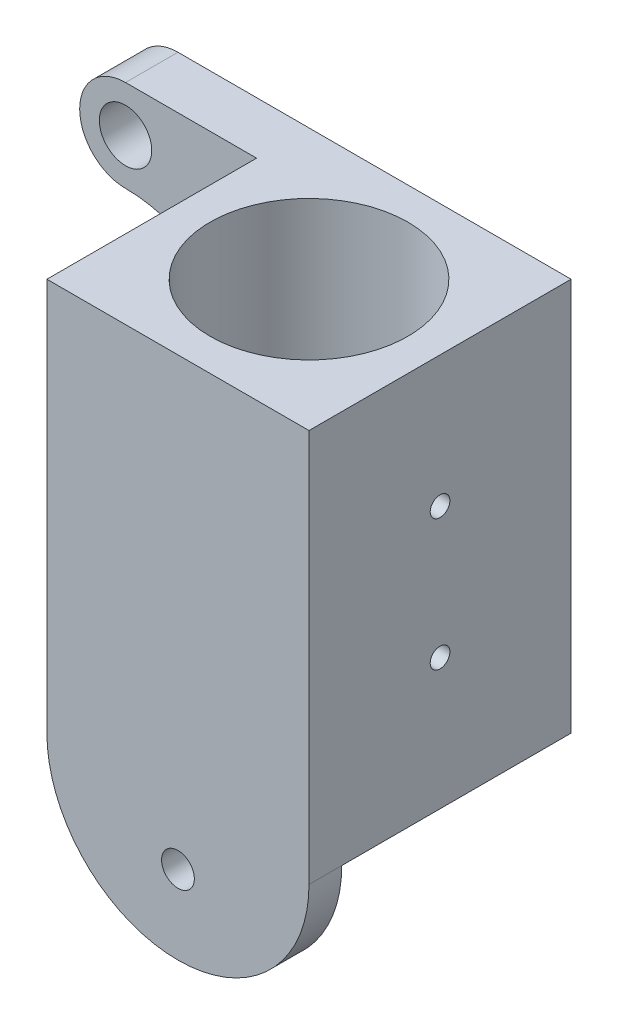
ISO-10303-21;
HEADER;
FILE_DESCRIPTION(('STEP AP214'),'2;1');
FILE_NAME('part.step','',(''),(''),'','','');
FILE_SCHEMA(('AUTOMOTIVE_DESIGN { 1 0 10303 214 1 1 1 1 }'));
ENDSEC;
DATA;
#1=APPLICATION_CONTEXT('core data for automotive mechanical design processes');
#2=APPLICATION_PROTOCOL_DEFINITION('international standard','automotive_design',2000,#1);
#3=PRODUCT_CONTEXT('',#1,'mechanical');
#4=PRODUCT('Part','Part','',(#3));
#5=PRODUCT_RELATED_PRODUCT_CATEGORY('part','',(#4));
#6=PRODUCT_DEFINITION_FORMATION('','',#4);
#7=PRODUCT_DEFINITION_CONTEXT('part definition',#1,'design');
#8=PRODUCT_DEFINITION('design','',#6,#7);
#9=PRODUCT_DEFINITION_SHAPE('','',#8);
#10=(LENGTH_UNIT() NAMED_UNIT(*) SI_UNIT(.MILLI.,.METRE.));
#11=(NAMED_UNIT(*) PLANE_ANGLE_UNIT() SI_UNIT($,.RADIAN.));
#12=(NAMED_UNIT(*) SI_UNIT($,.STERADIAN.) SOLID_ANGLE_UNIT());
#13=UNCERTAINTY_MEASURE_WITH_UNIT(LENGTH_MEASURE(1.E-05),#10,'distance_accuracy_value','');
#14=(GEOMETRIC_REPRESENTATION_CONTEXT(3) GLOBAL_UNCERTAINTY_ASSIGNED_CONTEXT((#13)) GLOBAL_UNIT_ASSIGNED_CONTEXT((#10,
#11,#12)) REPRESENTATION_CONTEXT('',''));
#15=CARTESIAN_POINT('',(0.,0.,0.));
#16=DIRECTION('',(0.,0.,1.));
#17=DIRECTION('',(1.,0.,0.));
#18=AXIS2_PLACEMENT_3D('',#15,#16,#17);
#19=CARTESIAN_POINT('',(-20.,60.,-20.));
#20=DIRECTION('',(1.,0.,0.));
#21=DIRECTION('',(0.,0.,-1.));
#22=AXIS2_PLACEMENT_3D('',#19,#20,#21);
#23=PLANE('',#22);
#24=CARTESIAN_POINT('',(-20.,20.,0.));
#25=DIRECTION('',(1.,0.,0.));
#26=DIRECTION('',(0.,0.,-1.));
#27=AXIS2_PLACEMENT_3D('',#24,#25,#26);
#28=CIRCLE('',#27,1.5);
#29=CARTESIAN_POINT('',(-20.,20.,-1.5));
#30=VERTEX_POINT('',#29);
#31=EDGE_CURVE('E182',#30,#30,#28,.T.);
#32=ORIENTED_EDGE('',*,*,#31,.T.);
#33=EDGE_LOOP('',(#32));
#34=FACE_BOUND('',#33,.T.);
#35=CARTESIAN_POINT('',(-20.,40.,0.));
#36=DIRECTION('',(1.,0.,0.));
#37=DIRECTION('',(0.,0.,-1.));
#38=AXIS2_PLACEMENT_3D('',#35,#36,#37);
#39=CIRCLE('',#38,1.5);
#40=CARTESIAN_POINT('',(-20.,40.,-1.5));
#41=VERTEX_POINT('',#40);
#42=EDGE_CURVE('E331',#41,#41,#39,.T.);
#43=ORIENTED_EDGE('',*,*,#42,.T.);
#44=EDGE_LOOP('',(#43));
#45=FACE_BOUND('',#44,.T.);
#46=DIRECTION('',(0.,1.,0.));
#47=VECTOR('',#46,1.);
#48=CARTESIAN_POINT('',(-20.,60.,-12.));
#49=LINE('',#48,#47);
#50=CARTESIAN_POINT('',(-20.,26.,-12.));
#51=VERTEX_POINT('',#50);
#52=CARTESIAN_POINT('',(-20.,60.,-12.));
#53=VERTEX_POINT('',#52);
#54=EDGE_CURVE('E57',#51,#53,#49,.T.);
#55=ORIENTED_EDGE('',*,*,#54,.F.);
#56=DIRECTION('',(0.,0.,1.));
#57=VECTOR('',#56,1.);
#58=CARTESIAN_POINT('',(-20.,26.,-20.));
#59=LINE('',#58,#57);
#60=CARTESIAN_POINT('',(-20.,26.,-20.));
#61=VERTEX_POINT('',#60);
#62=EDGE_CURVE('E62',#51,#61,#59,.F.);
#63=ORIENTED_EDGE('',*,*,#62,.T.);
#64=DIRECTION('',(0.,-1.,0.));
#65=VECTOR('',#64,1.);
#66=CARTESIAN_POINT('',(-20.,60.,-20.));
#67=LINE('',#66,#65);
#68=CARTESIAN_POINT('',(-20.,0.,-20.));
#69=VERTEX_POINT('',#68);
#70=EDGE_CURVE('E165',#61,#69,#67,.T.);
#71=ORIENTED_EDGE('',*,*,#70,.T.);
#72=DIRECTION('',(0.,0.,1.));
#73=VECTOR('',#72,1.);
#74=CARTESIAN_POINT('',(-20.,0.,-20.));
#75=LINE('',#74,#73);
#76=CARTESIAN_POINT('',(-20.,0.,15.));
#77=VERTEX_POINT('',#76);
#78=EDGE_CURVE('E150',#69,#77,#75,.T.);
#79=ORIENTED_EDGE('',*,*,#78,.T.);
#80=DIRECTION('',(0.,0.,1.));
#81=VECTOR('',#80,1.);
#82=CARTESIAN_POINT('',(-20.,0.,15.));
#83=LINE('',#82,#81);
#84=CARTESIAN_POINT('',(-20.,0.,20.));
#85=VERTEX_POINT('',#84);
#86=EDGE_CURVE('E119',#77,#85,#83,.T.);
#87=ORIENTED_EDGE('',*,*,#86,.T.);
#88=DIRECTION('',(0.,-1.,0.));
#89=VECTOR('',#88,1.);
#90=CARTESIAN_POINT('',(-20.,60.,20.));
#91=LINE('',#90,#89);
#92=CARTESIAN_POINT('',(-20.,60.,20.));
#93=VERTEX_POINT('',#92);
#94=EDGE_CURVE('E161',#93,#85,#91,.T.);
#95=ORIENTED_EDGE('',*,*,#94,.F.);
#96=DIRECTION('',(0.,0.,1.));
#97=VECTOR('',#96,1.);
#98=CARTESIAN_POINT('',(-20.,60.,-20.));
#99=LINE('',#98,#97);
#100=EDGE_CURVE('E296',#53,#93,#99,.T.);
#101=ORIENTED_EDGE('',*,*,#100,.F.);
#102=EDGE_LOOP('',(#55,#63,#71,#79,#87,#95,#101));
#103=FACE_BOUND('',#102,.T.);
#104=ADVANCED_FACE('F41',(#34,#45,#103),#23,.F.);
#105=CARTESIAN_POINT('',(0.,0.,0.));
#106=DIRECTION('',(0.,1.,0.));
#107=DIRECTION('',(0.,0.,1.));
#108=AXIS2_PLACEMENT_3D('',#105,#106,#107);
#109=PLANE('',#108);
#110=DIRECTION('',(-1.,0.,0.));
#111=VECTOR('',#110,1.);
#112=CARTESIAN_POINT('',(-20.,0.,15.));
#113=LINE('',#112,#111);
#114=CARTESIAN_POINT('',(20.,0.,15.));
#115=VERTEX_POINT('',#114);
#116=EDGE_CURVE('E123',#115,#77,#113,.T.);
#117=ORIENTED_EDGE('',*,*,#116,.T.);
#118=ORIENTED_EDGE('',*,*,#78,.F.);
#119=DIRECTION('',(-1.,0.,0.));
#120=VECTOR('',#119,1.);
#121=CARTESIAN_POINT('',(-20.,0.,-20.));
#122=LINE('',#121,#120);
#123=CARTESIAN_POINT('',(20.,0.,-20.));
#124=VERTEX_POINT('',#123);
#125=EDGE_CURVE('E137',#124,#69,#122,.T.);
#126=ORIENTED_EDGE('',*,*,#125,.F.);
#127=DIRECTION('',(0.,0.,-1.));
#128=VECTOR('',#127,1.);
#129=CARTESIAN_POINT('',(20.,0.,-20.));
#130=LINE('',#129,#128);
#131=EDGE_CURVE('E134',#115,#124,#130,.T.);
#132=ORIENTED_EDGE('',*,*,#131,.F.);
#133=EDGE_LOOP('',(#117,#118,#126,#132));
#134=FACE_BOUND('',#133,.T.);
#135=ADVANCED_FACE('F135',(#134),#109,.F.);
#136=CARTESIAN_POINT('',(20.,60.,-20.));
#137=DIRECTION('',(-1.,0.,0.));
#138=DIRECTION('',(0.,0.,1.));
#139=AXIS2_PLACEMENT_3D('',#136,#137,#138);
#140=PLANE('',#139);
#141=CARTESIAN_POINT('',(20.,40.,0.));
#142=DIRECTION('',(1.,0.,0.));
#143=DIRECTION('',(0.,0.,-1.));
#144=AXIS2_PLACEMENT_3D('',#141,#142,#143);
#145=CIRCLE('',#144,1.5);
#146=CARTESIAN_POINT('',(20.,40.,-1.5));
#147=VERTEX_POINT('',#146);
#148=EDGE_CURVE('E327',#147,#147,#145,.T.);
#149=ORIENTED_EDGE('',*,*,#148,.F.);
#150=EDGE_LOOP('',(#149));
#151=FACE_BOUND('',#150,.T.);
#152=CARTESIAN_POINT('',(20.,20.,0.));
#153=DIRECTION('',(1.,0.,0.));
#154=DIRECTION('',(0.,0.,-1.));
#155=AXIS2_PLACEMENT_3D('',#152,#153,#154);
#156=CIRCLE('',#155,1.5);
#157=CARTESIAN_POINT('',(20.,20.,-1.5));
#158=VERTEX_POINT('',#157);
#159=EDGE_CURVE('E320',#158,#158,#156,.T.);
#160=ORIENTED_EDGE('',*,*,#159,.F.);
#161=EDGE_LOOP('',(#160));
#162=FACE_BOUND('',#161,.T.);
#163=CARTESIAN_POINT('',(20.,0.,20.));
#164=VERTEX_POINT('',#163);
#165=EDGE_CURVE('E116',#164,#115,#130,.T.);
#166=ORIENTED_EDGE('',*,*,#165,.T.);
#167=ORIENTED_EDGE('',*,*,#131,.T.);
#168=DIRECTION('',(0.,-1.,0.));
#169=VECTOR('',#168,1.);
#170=CARTESIAN_POINT('',(20.,60.,-20.));
#171=LINE('',#170,#169);
#172=CARTESIAN_POINT('',(20.,60.,-20.));
#173=VERTEX_POINT('',#172);
#174=EDGE_CURVE('E168',#173,#124,#171,.T.);
#175=ORIENTED_EDGE('',*,*,#174,.F.);
#176=DIRECTION('',(0.,0.,-1.));
#177=VECTOR('',#176,1.);
#178=CARTESIAN_POINT('',(20.,60.,-20.));
#179=LINE('',#178,#177);
#180=CARTESIAN_POINT('',(20.,60.,20.));
#181=VERTEX_POINT('',#180);
#182=EDGE_CURVE('E158',#181,#173,#179,.T.);
#183=ORIENTED_EDGE('',*,*,#182,.F.);
#184=DIRECTION('',(0.,-1.,0.));
#185=VECTOR('',#184,1.);
#186=CARTESIAN_POINT('',(20.,60.,20.));
#187=LINE('',#186,#185);
#188=EDGE_CURVE('E147',#181,#164,#187,.T.);
#189=ORIENTED_EDGE('',*,*,#188,.T.);
#190=EDGE_LOOP('',(#166,#167,#175,#183,#189));
#191=FACE_BOUND('',#190,.T.);
#192=ADVANCED_FACE('F144',(#151,#162,#191),#140,.F.);
#193=CARTESIAN_POINT('',(-20.,60.,-20.));
#194=DIRECTION('',(0.,0.,1.));
#195=DIRECTION('',(1.,0.,0.));
#196=AXIS2_PLACEMENT_3D('',#193,#194,#195);
#197=PLANE('',#196);
#198=CARTESIAN_POINT('',(-40.,53.,-20.));
#199=DIRECTION('',(0.,0.,-1.));
#200=DIRECTION('',(-1.,0.,0.));
#201=AXIS2_PLACEMENT_3D('',#198,#199,#200);
#202=CIRCLE('',#201,4.00000000000001);
#203=CARTESIAN_POINT('',(-44.,53.,-20.));
#204=VERTEX_POINT('',#203);
#205=EDGE_CURVE('E344',#204,#204,#202,.T.);
#206=ORIENTED_EDGE('',*,*,#205,.F.);
#207=EDGE_LOOP('',(#206));
#208=FACE_BOUND('',#207,.T.);
#209=ORIENTED_EDGE('',*,*,#70,.F.);
#210=CARTESIAN_POINT('',(-40.,26.,-20.));
#211=DIRECTION('',(0.,0.,1.));
#212=DIRECTION('',(1.,0.,0.));
#213=AXIS2_PLACEMENT_3D('',#210,#211,#212);
#214=CIRCLE('',#213,20.);
#215=CARTESIAN_POINT('',(-40.,46.,-20.));
#216=VERTEX_POINT('',#215);
#217=EDGE_CURVE('E11',#61,#216,#214,.T.);
#218=ORIENTED_EDGE('',*,*,#217,.T.);
#219=CARTESIAN_POINT('',(-40.,53.,-20.));
#220=DIRECTION('',(0.,0.,1.));
#221=DIRECTION('',(1.,0.,0.));
#222=AXIS2_PLACEMENT_3D('',#219,#220,#221);
#223=CIRCLE('',#222,7.);
#224=CARTESIAN_POINT('',(-47.,53.,-20.));
#225=VERTEX_POINT('',#224);
#226=EDGE_CURVE('E262',#216,#225,#223,.F.);
#227=ORIENTED_EDGE('',*,*,#226,.T.);
#228=CARTESIAN_POINT('',(-40.,53.,-20.));
#229=DIRECTION('',(0.,0.,1.));
#230=DIRECTION('',(1.,0.,0.));
#231=AXIS2_PLACEMENT_3D('',#228,#229,#230);
#232=CIRCLE('',#231,7.);
#233=CARTESIAN_POINT('',(-40.,60.,-20.));
#234=VERTEX_POINT('',#233);
#235=EDGE_CURVE('E256',#225,#234,#232,.F.);
#236=ORIENTED_EDGE('',*,*,#235,.T.);
#237=DIRECTION('',(-1.,0.,0.));
#238=VECTOR('',#237,1.);
#239=CARTESIAN_POINT('',(-20.,60.,-20.));
#240=LINE('',#239,#238);
#241=EDGE_CURVE('E293',#173,#234,#240,.T.);
#242=ORIENTED_EDGE('',*,*,#241,.F.);
#243=ORIENTED_EDGE('',*,*,#174,.T.);
#244=ORIENTED_EDGE('',*,*,#125,.T.);
#245=EDGE_LOOP('',(#209,#218,#227,#236,#242,#243,#244));
#246=FACE_BOUND('',#245,.T.);
#247=ADVANCED_FACE('F232',(#208,#246),#197,.F.);
#248=CARTESIAN_POINT('',(-20.,60.,20.));
#249=DIRECTION('',(0.,0.,-1.));
#250=DIRECTION('',(-1.,0.,0.));
#251=AXIS2_PLACEMENT_3D('',#248,#249,#250);
#252=PLANE('',#251);
#253=ORIENTED_EDGE('',*,*,#94,.T.);
#254=CARTESIAN_POINT('',(0.,0.,20.));
#255=DIRECTION('',(0.,0.,1.));
#256=DIRECTION('',(1.,0.,0.));
#257=AXIS2_PLACEMENT_3D('',#254,#255,#256);
#258=CIRCLE('',#257,20.);
#259=EDGE_CURVE('E124',#85,#164,#258,.T.);
#260=ORIENTED_EDGE('',*,*,#259,.T.);
#261=ORIENTED_EDGE('',*,*,#188,.F.);
#262=DIRECTION('',(1.,0.,0.));
#263=VECTOR('',#262,1.);
#264=CARTESIAN_POINT('',(-20.,60.,20.));
#265=LINE('',#264,#263);
#266=EDGE_CURVE('E153',#93,#181,#265,.T.);
#267=ORIENTED_EDGE('',*,*,#266,.F.);
#268=EDGE_LOOP('',(#253,#260,#261,#267));
#269=FACE_BOUND('',#268,.T.);
#270=CARTESIAN_POINT('',(0.,-8.,20.));
#271=DIRECTION('',(0.,0.,1.));
#272=DIRECTION('',(1.,0.,0.));
#273=AXIS2_PLACEMENT_3D('',#270,#271,#272);
#274=CIRCLE('',#273,2.5);
#275=CARTESIAN_POINT('',(2.5,-8.,20.));
#276=VERTEX_POINT('',#275);
#277=EDGE_CURVE('E313',#276,#276,#274,.T.);
#278=ORIENTED_EDGE('',*,*,#277,.F.);
#279=EDGE_LOOP('',(#278));
#280=FACE_BOUND('',#279,.T.);
#281=ADVANCED_FACE('F231',(#269,#280),#252,.F.);
#282=CARTESIAN_POINT('',(0.,60.,0.));
#283=DIRECTION('',(0.,1.,0.));
#284=DIRECTION('',(0.,0.,1.));
#285=AXIS2_PLACEMENT_3D('',#282,#283,#284);
#286=PLANE('',#285);
#287=CARTESIAN_POINT('',(0.,60.,0.));
#288=DIRECTION('',(0.,1.,0.));
#289=DIRECTION('',(0.,0.,1.));
#290=AXIS2_PLACEMENT_3D('',#287,#288,#289);
#291=CIRCLE('',#290,15.1);
#292=CARTESIAN_POINT('',(0.,60.,15.1));
#293=VERTEX_POINT('',#292);
#294=EDGE_CURVE('E302',#293,#293,#291,.T.);
#295=ORIENTED_EDGE('',*,*,#294,.F.);
#296=EDGE_LOOP('',(#295));
#297=FACE_BOUND('',#296,.T.);
#298=ORIENTED_EDGE('',*,*,#241,.T.);
#299=DIRECTION('',(0.,0.,-1.));
#300=VECTOR('',#299,1.);
#301=CARTESIAN_POINT('',(-40.,60.,0.));
#302=LINE('',#301,#300);
#303=CARTESIAN_POINT('',(-40.,60.,-12.));
#304=VERTEX_POINT('',#303);
#305=EDGE_CURVE('E254',#234,#304,#302,.F.);
#306=ORIENTED_EDGE('',*,*,#305,.T.);
#307=DIRECTION('',(1.,0.,0.));
#308=VECTOR('',#307,1.);
#309=CARTESIAN_POINT('',(-47.,60.,-12.));
#310=LINE('',#309,#308);
#311=EDGE_CURVE('E332',#304,#53,#310,.T.);
#312=ORIENTED_EDGE('',*,*,#311,.T.);
#313=ORIENTED_EDGE('',*,*,#100,.T.);
#314=ORIENTED_EDGE('',*,*,#266,.T.);
#315=ORIENTED_EDGE('',*,*,#182,.T.);
#316=EDGE_LOOP('',(#298,#306,#312,#313,#314,#315));
#317=FACE_BOUND('',#316,.T.);
#318=ADVANCED_FACE('F217',(#297,#317),#286,.T.);
#319=CARTESIAN_POINT('',(0.,9.99999999999999,0.));
#320=DIRECTION('',(0.,1.,0.));
#321=DIRECTION('',(0.,0.,1.));
#322=AXIS2_PLACEMENT_3D('',#319,#320,#321);
#323=CYLINDRICAL_SURFACE('',#322,15.1);
#324=CARTESIAN_POINT('',(-15.0253119767944,40.,-1.5));
#325=CARTESIAN_POINT('',(-15.025312956074,39.9159676620919,-1.49999635854613));
#326=CARTESIAN_POINT('',(-15.0260245276725,39.8318796909114,-1.49291478510042));
#327=CARTESIAN_POINT('',(-15.028793551497,39.6660349131521,-1.46477185820528));
#328=CARTESIAN_POINT('',(-15.03085248871,39.5842807826705,-1.44369507968879));
#329=CARTESIAN_POINT('',(-15.0360807748948,39.4255293978987,-1.38818135253405));
#330=CARTESIAN_POINT('',(-15.0392494524589,39.3485293004147,-1.35375248074173));
#331=CARTESIAN_POINT('',(-15.0463393621317,39.201417488061,-1.27252733745513));
#332=CARTESIAN_POINT('',(-15.05026044424,39.1313044043924,-1.22573353035035));
#333=CARTESIAN_POINT('',(-15.0584291270942,38.9996884271419,-1.12092628167147));
#334=CARTESIAN_POINT('',(-15.0626777301768,38.9382137328839,-1.06287750232365));
#335=CARTESIAN_POINT('',(-15.0710136412484,38.8258623723675,-0.937283575420634));
#336=CARTESIAN_POINT('',(-15.0751009418651,38.7749861900552,-0.869737994461096));
#337=CARTESIAN_POINT('',(-15.0826635983521,38.6851787557144,-0.72689531541232));
#338=CARTESIAN_POINT('',(-15.0861376707466,38.6462724329321,-0.651582470180894));
#339=CARTESIAN_POINT('',(-15.0920715347339,38.5816686124249,-0.495452469131725));
#340=CARTESIAN_POINT('',(-15.0945313507482,38.5559707966588,-0.414635445899537));
#341=CARTESIAN_POINT('',(-15.0981525138302,38.5185960854439,-0.250075883600476));
#342=CARTESIAN_POINT('',(-15.0993181456551,38.5068729134921,-0.166343950618246));
#343=CARTESIAN_POINT('',(-15.100234174601,38.4976370858915,0.00190655759439232));
#344=CARTESIAN_POINT('',(-15.0999846079687,38.5001240662856,0.0864251126221106));
#345=CARTESIAN_POINT('',(-15.0981018679929,38.5192003682383,0.253535560434282));
#346=CARTESIAN_POINT('',(-15.0964735769364,38.5357399280402,0.336133196401713));
#347=CARTESIAN_POINT('',(-15.0920219994832,38.5823743756564,0.497374352123942));
#348=CARTESIAN_POINT('',(-15.0891986977396,38.612469437557,0.576017821082989));
#349=CARTESIAN_POINT('',(-15.0826661343107,38.685415201237,0.727275160741129));
#350=CARTESIAN_POINT('',(-15.0789553445811,38.7282879348315,0.799878337650498));
#351=CARTESIAN_POINT('',(-15.0710642123586,38.8255560438999,0.936877465459625));
#352=CARTESIAN_POINT('',(-15.0668838562791,38.879951752825,1.00127317876582));
#353=CARTESIAN_POINT('',(-15.0585014337633,38.9990016032106,1.12032085957513));
#354=CARTESIAN_POINT('',(-15.054299351531,39.0636990304483,1.17492954862421));
#355=CARTESIAN_POINT('',(-15.0463651004589,39.201365684078,1.27251801061355));
#356=CARTESIAN_POINT('',(-15.0426329322861,39.2743349222103,1.31549776704826));
#357=CARTESIAN_POINT('',(-15.0360607178808,39.426507005085,1.38860805601259));
#358=CARTESIAN_POINT('',(-15.0332208560381,39.505711134007,1.41873593323833));
#359=CARTESIAN_POINT('',(-15.0287585753405,39.6680883326636,1.46525308871646));
#360=CARTESIAN_POINT('',(-15.0271361198954,39.7512612830321,1.48164277988374));
#361=CARTESIAN_POINT('',(-15.0252986591232,39.9188352636901,1.50016268663854));
#362=CARTESIAN_POINT('',(-15.0250776785925,40.0032295405848,1.50235344042828));
#363=CARTESIAN_POINT('',(-15.0260524182927,40.1711840102969,1.49257225368717));
#364=CARTESIAN_POINT('',(-15.0272481196383,40.2547442142182,1.48060050195128));
#365=CARTESIAN_POINT('',(-15.0309160596127,40.4184822238691,1.44288477969783));
#366=CARTESIAN_POINT('',(-15.0333856461404,40.4986666838853,1.41716941799686));
#367=CARTESIAN_POINT('',(-15.0393209391003,40.6535838762131,1.35272564260952));
#368=CARTESIAN_POINT('',(-15.0427866680578,40.7283164851969,1.31399693465547));
#369=CARTESIAN_POINT('',(-15.0503382064572,40.8704845722181,1.2244741127262));
#370=CARTESIAN_POINT('',(-15.0544260614167,40.9378946728515,1.17363987299589));
#371=CARTESIAN_POINT('',(-15.0627545443571,41.0632469104025,1.06140651663175));
#372=CARTESIAN_POINT('',(-15.0669951760684,41.1211888159303,1.00000714187558));
#373=CARTESIAN_POINT('',(-15.0751694218504,41.2261685790411,0.868123835144984));
#374=CARTESIAN_POINT('',(-15.0791018911967,41.2731669510903,0.797608391658785));
#375=CARTESIAN_POINT('',(-15.0862000664518,41.3546538558809,0.649650329668303));
#376=CARTESIAN_POINT('',(-15.0893657827459,41.389142558064,0.572207805008102));
#377=CARTESIAN_POINT('',(-15.0945685839412,41.4445641728181,0.412731881610149));
#378=CARTESIAN_POINT('',(-15.0966076555916,41.4655209589395,0.330706846940061));
#379=CARTESIAN_POINT('',(-15.099335565752,41.4933617737986,0.164281005364229));
#380=CARTESIAN_POINT('',(-15.1000244416734,41.5002461924544,0.0798802643504142));
#381=CARTESIAN_POINT('',(-15.0999743264919,41.4997414076765,-0.0885132586038638));
#382=CARTESIAN_POINT('',(-15.0992414683536,41.4924135122405,-0.172506232884098));
#383=CARTESIAN_POINT('',(-15.096442335095,41.4638206390987,-0.338061727779914));
#384=CARTESIAN_POINT('',(-15.0943760588904,41.4425556500599,-0.419624246419132));
#385=CARTESIAN_POINT('',(-15.0891416171645,41.3867091488097,-0.578003288244201));
#386=CARTESIAN_POINT('',(-15.0859735976019,41.3521294004693,-0.654820438508598));
#387=CARTESIAN_POINT('',(-15.078888864656,41.2706415319087,-0.801569837575121));
#388=CARTESIAN_POINT('',(-15.0749721559724,41.2237334890742,-0.871502129590262));
#389=CARTESIAN_POINT('',(-15.0668086636542,41.1186906745015,-1.00281085394436));
#390=CARTESIAN_POINT('',(-15.0625605816352,41.0605102643219,-1.06415069694839));
#391=CARTESIAN_POINT('',(-15.0542241088092,40.9346639349868,-1.17622425255196));
#392=CARTESIAN_POINT('',(-15.050135756584,40.8669957419999,-1.22695541540431));
#393=CARTESIAN_POINT('',(-15.042570630608,40.7239089433625,-1.31647186691678));
#394=CARTESIAN_POINT('',(-15.0390954200226,40.6484712829841,-1.35522680653066));
#395=CARTESIAN_POINT('',(-15.0331686996374,40.4921729527212,-1.41946790711139));
#396=CARTESIAN_POINT('',(-15.0307160348248,40.4113185218565,-1.444969046934));
#397=CARTESIAN_POINT('',(-15.0277311589647,40.2750045514355,-1.47561362318629));
#398=CARTESIAN_POINT('',(-15.0268282506956,40.2204167180033,-1.48474603116336));
#399=CARTESIAN_POINT('',(-15.0256183386627,40.1105606166398,-1.49694040505908));
#400=CARTESIAN_POINT('',(-15.0253113324391,40.0552923515182,-1.50000239603648));
#401=CARTESIAN_POINT('',(-15.0253119767944,40.,-1.5));
#402=B_SPLINE_CURVE_WITH_KNOTS('',3,(#324,#325,#326,#327,#328,#329,#330,#331,#332,#333,#334,
#335,#336,#337,#338,#339,#340,#341,#342,#343,#344,#345,#346,#347,#348,#349,#350,#351,#352,#353,
#354,#355,#356,#357,#358,#359,#360,#361,#362,#363,#364,#365,#366,#367,#368,#369,#370,#371,#372,
#373,#374,#375,#376,#377,#378,#379,#380,#381,#382,#383,#384,#385,#386,#387,#388,#389,#390,#391,
#392,#393,#394,#395,#396,#397,#398,#399,#400,#401),.UNSPECIFIED.,.T.,.F.,(4,2,2,2,2,2,2,2,2,2,2,
2,2,2,2,2,2,2,2,2,2,2,2,2,2,2,2,2,2,2,2,2,2,2,2,2,2,2,4),(0.,0.251895097196481,0.50406828696038,
0.75608917138904,1.00805986471088,1.26083488254587,1.51362143998953,1.76693095868192,
2.02023437776912,2.27269664114699,2.52515243837155,2.77671796950038,3.02828673144791,
3.28029179364622,3.53230414935096,3.7854047994611,4.03850580880849,4.29165908560718,
4.54480475335873,4.79687040216313,5.04893269081457,5.30047231646477,5.552017630503,
5.80440863162634,6.05680579992193,6.31010000309801,6.56339077531053,6.81623345189484,
7.06906912260185,7.32081655553196,7.57256419316889,7.82427849203737,8.07599121091297,
8.32874517901135,8.58155982571251,8.83500997565597,9.08817306120622,9.25391794111063,
9.41966213681694),.UNSPECIFIED.);
#403=CARTESIAN_POINT('',(-15.0253119767944,40.,-1.5));
#404=VERTEX_POINT('',#403);
#405=EDGE_CURVE('E324',#404,#404,#402,.T.);
#406=ORIENTED_EDGE('',*,*,#405,.T.);
#407=EDGE_LOOP('',(#406));
#408=FACE_BOUND('',#407,.T.);
#409=CARTESIAN_POINT('',(15.0253119767944,40.,-1.5));
#410=CARTESIAN_POINT('',(15.025312956074,40.0840323379081,-1.49999635854613));
#411=CARTESIAN_POINT('',(15.0260245276725,40.1681203090886,-1.49291478510043));
#412=CARTESIAN_POINT('',(15.028793551497,40.3339650868479,-1.46477185820529));
#413=CARTESIAN_POINT('',(15.03085248871,40.4157192173295,-1.44369507968879));
#414=CARTESIAN_POINT('',(15.0360807748948,40.5744706021013,-1.38818135253405));
#415=CARTESIAN_POINT('',(15.0392494524589,40.6514706995853,-1.35375248074173));
#416=CARTESIAN_POINT('',(15.0463393621317,40.798582511939,-1.27252733745513));
#417=CARTESIAN_POINT('',(15.05026044424,40.8686955956076,-1.22573353035035));
#418=CARTESIAN_POINT('',(15.0584291270942,41.0003115728581,-1.12092628167147));
#419=CARTESIAN_POINT('',(15.0626777301768,41.0617862671161,-1.06287750232365));
#420=CARTESIAN_POINT('',(15.0710136412484,41.1741376276325,-0.937283575420637));
#421=CARTESIAN_POINT('',(15.0751009418651,41.2250138099448,-0.869737994461099));
#422=CARTESIAN_POINT('',(15.0826635983521,41.3148212442856,-0.726895315412323));
#423=CARTESIAN_POINT('',(15.0861376707466,41.3537275670679,-0.651582470180896));
#424=CARTESIAN_POINT('',(15.0920715347339,41.4183313875751,-0.495452469131727));
#425=CARTESIAN_POINT('',(15.0945313507482,41.4440292033412,-0.41463544589954));
#426=CARTESIAN_POINT('',(15.0981525138302,41.4814039145561,-0.250075883600479));
#427=CARTESIAN_POINT('',(15.0993181456551,41.4931270865079,-0.166343950618248));
#428=CARTESIAN_POINT('',(15.100234174601,41.5023629141085,0.00190655759438969));
#429=CARTESIAN_POINT('',(15.0999846079687,41.4998759337144,0.086425112622108));
#430=CARTESIAN_POINT('',(15.0981018679929,41.4807996317617,0.253535560434279));
#431=CARTESIAN_POINT('',(15.0964735769364,41.4642600719598,0.33613319640171));
#432=CARTESIAN_POINT('',(15.0920219994832,41.4176256243436,0.497374352123939));
#433=CARTESIAN_POINT('',(15.0891986977396,41.387530562443,0.576017821082986));
#434=CARTESIAN_POINT('',(15.0826661343107,41.314584798763,0.727275160741126));
#435=CARTESIAN_POINT('',(15.0789553445811,41.2717120651685,0.799878337650496));
#436=CARTESIAN_POINT('',(15.0710642123586,41.1744439561001,0.936877465459623));
#437=CARTESIAN_POINT('',(15.0668838562791,41.120048247175,1.00127317876582));
#438=CARTESIAN_POINT('',(15.0585014337633,41.0009983967895,1.12032085957512));
#439=CARTESIAN_POINT('',(15.054299351531,40.9363009695517,1.1749295486242));
#440=CARTESIAN_POINT('',(15.0463651004589,40.798634315922,1.27251801061355));
#441=CARTESIAN_POINT('',(15.0426329322861,40.7256650777897,1.31549776704826));
#442=CARTESIAN_POINT('',(15.0360607178808,40.573492994915,1.38860805601259));
#443=CARTESIAN_POINT('',(15.0332208560381,40.494288865993,1.41873593323833));
#444=CARTESIAN_POINT('',(15.0287585753405,40.3319116673364,1.46525308871646));
#445=CARTESIAN_POINT('',(15.0271361198954,40.2487387169679,1.48164277988374));
#446=CARTESIAN_POINT('',(15.0252986591232,40.0811647363099,1.50016268663854));
#447=CARTESIAN_POINT('',(15.0250776785925,39.9967704594153,1.50235344042828));
#448=CARTESIAN_POINT('',(15.0260524182927,39.8288159897031,1.49257225368717));
#449=CARTESIAN_POINT('',(15.0272481196383,39.7452557857818,1.48060050195127));
#450=CARTESIAN_POINT('',(15.0309160596127,39.5815177761309,1.44288477969783));
#451=CARTESIAN_POINT('',(15.0333856461404,39.5013333161148,1.41716941799686));
#452=CARTESIAN_POINT('',(15.0393209391003,39.3464161237869,1.35272564260952));
#453=CARTESIAN_POINT('',(15.0427866680578,39.2716835148031,1.31399693465547));
#454=CARTESIAN_POINT('',(15.0503382064572,39.1295154277819,1.2244741127262));
#455=CARTESIAN_POINT('',(15.0544260614167,39.0621053271485,1.17363987299589));
#456=CARTESIAN_POINT('',(15.0627545443571,38.9367530895975,1.06140651663175));
#457=CARTESIAN_POINT('',(15.0669951760684,38.8788111840697,1.00000714187558));
#458=CARTESIAN_POINT('',(15.0751694218504,38.7738314209589,0.868123835144981));
#459=CARTESIAN_POINT('',(15.0791018911967,38.7268330489097,0.797608391658783));
#460=CARTESIAN_POINT('',(15.0862000664518,38.6453461441191,0.6496503296683));
#461=CARTESIAN_POINT('',(15.0893657827459,38.610857441936,0.572207805008099));
#462=CARTESIAN_POINT('',(15.0945685839412,38.5554358271819,0.412731881610147));
#463=CARTESIAN_POINT('',(15.0966076555916,38.5344790410605,0.330706846940059));
#464=CARTESIAN_POINT('',(15.099335565752,38.5066382262014,0.164281005364227));
#465=CARTESIAN_POINT('',(15.1000244416734,38.4997538075456,0.0798802643504125));
#466=CARTESIAN_POINT('',(15.0999743264919,38.5002585923235,-0.0885132586038657));
#467=CARTESIAN_POINT('',(15.0992414683536,38.5075864877595,-0.1725062328841));
#468=CARTESIAN_POINT('',(15.096442335095,38.5361793609014,-0.338061727779916));
#469=CARTESIAN_POINT('',(15.0943760588904,38.5574443499401,-0.419624246419133));
#470=CARTESIAN_POINT('',(15.0891416171645,38.6132908511903,-0.578003288244204));
#471=CARTESIAN_POINT('',(15.0859735976019,38.6478705995307,-0.654820438508602));
#472=CARTESIAN_POINT('',(15.078888864656,38.7293584680913,-0.801569837575126));
#473=CARTESIAN_POINT('',(15.0749721559724,38.7762665109258,-0.871502129590266));
#474=CARTESIAN_POINT('',(15.0668086636542,38.8813093254985,-1.00281085394436));
#475=CARTESIAN_POINT('',(15.0625605816352,38.9394897356781,-1.06415069694839));
#476=CARTESIAN_POINT('',(15.0542241088092,39.0653360650132,-1.17622425255196));
#477=CARTESIAN_POINT('',(15.050135756584,39.1330042580001,-1.22695541540431));
#478=CARTESIAN_POINT('',(15.042570630608,39.2760910566375,-1.31647186691678));
#479=CARTESIAN_POINT('',(15.0390954200226,39.3515287170159,-1.35522680653066));
#480=CARTESIAN_POINT('',(15.0331686996374,39.5078270472788,-1.41946790711139));
#481=CARTESIAN_POINT('',(15.0307160348248,39.5886814781435,-1.444969046934));
#482=CARTESIAN_POINT('',(15.0277311589647,39.7249954485645,-1.47561362318629));
#483=CARTESIAN_POINT('',(15.0268282506956,39.7795832819967,-1.48474603116336));
#484=CARTESIAN_POINT('',(15.0256183386627,39.8894393833602,-1.49694040505908));
#485=CARTESIAN_POINT('',(15.0253113324391,39.9447076484818,-1.50000239603649));
#486=CARTESIAN_POINT('',(15.0253119767944,40.,-1.5));
#487=B_SPLINE_CURVE_WITH_KNOTS('',3,(#409,#410,#411,#412,#413,#414,#415,#416,#417,#418,#419,
#420,#421,#422,#423,#424,#425,#426,#427,#428,#429,#430,#431,#432,#433,#434,#435,#436,#437,#438,
#439,#440,#441,#442,#443,#444,#445,#446,#447,#448,#449,#450,#451,#452,#453,#454,#455,#456,#457,
#458,#459,#460,#461,#462,#463,#464,#465,#466,#467,#468,#469,#470,#471,#472,#473,#474,#475,#476,
#477,#478,#479,#480,#481,#482,#483,#484,#485,#486),.UNSPECIFIED.,.T.,.F.,(4,2,2,2,2,2,2,2,2,2,2,
2,2,2,2,2,2,2,2,2,2,2,2,2,2,2,2,2,2,2,2,2,2,2,2,2,2,2,4),(0.,0.251895097196481,0.50406828696038,
0.75608917138904,1.00805986471088,1.26083488254587,1.51362143998953,1.76693095868192,
2.02023437776912,2.27269664114699,2.52515243837155,2.77671796950038,3.02828673144791,
3.28029179364622,3.53230414935095,3.78540479946109,4.03850580880849,4.29165908560718,
4.54480475335872,4.79687040216313,5.04893269081456,5.30047231646477,5.552017630503,
5.80440863162633,6.05680579992193,6.31010000309801,6.56339077531053,6.81623345189484,
7.06906912260185,7.32081655553195,7.57256419316888,7.82427849203737,8.07599121091297,
8.32874517901134,8.58155982571251,8.83500997565596,9.08817306120623,9.25391794111063,
9.41966213681694),.UNSPECIFIED.);
#488=CARTESIAN_POINT('',(15.0253119767944,40.,-1.5));
#489=VERTEX_POINT('',#488);
#490=EDGE_CURVE('E336',#489,#489,#487,.T.);
#491=ORIENTED_EDGE('',*,*,#490,.T.);
#492=EDGE_LOOP('',(#491));
#493=FACE_BOUND('',#492,.T.);
#494=CARTESIAN_POINT('',(-15.0253119767944,20.,-1.5));
#495=CARTESIAN_POINT('',(-15.025312956074,19.9159676620919,-1.49999635854613));
#496=CARTESIAN_POINT('',(-15.0260245276725,19.8318796909114,-1.49291478510042));
#497=CARTESIAN_POINT('',(-15.028793551497,19.6660349131521,-1.46477185820528));
#498=CARTESIAN_POINT('',(-15.03085248871,19.5842807826705,-1.44369507968879));
#499=CARTESIAN_POINT('',(-15.0360807748948,19.4255293978987,-1.38818135253405));
#500=CARTESIAN_POINT('',(-15.0392494524589,19.3485293004147,-1.35375248074173));
#501=CARTESIAN_POINT('',(-15.0463393621317,19.201417488061,-1.27252733745513));
#502=CARTESIAN_POINT('',(-15.05026044424,19.1313044043924,-1.22573353035035));
#503=CARTESIAN_POINT('',(-15.0584291270942,18.9996884271419,-1.12092628167147));
#504=CARTESIAN_POINT('',(-15.0626777301768,18.9382137328839,-1.06287750232365));
#505=CARTESIAN_POINT('',(-15.0710136412484,18.8258623723675,-0.937283575420637));
#506=CARTESIAN_POINT('',(-15.0751009418651,18.7749861900552,-0.869737994461099));
#507=CARTESIAN_POINT('',(-15.0826635983521,18.6851787557144,-0.726895315412322));
#508=CARTESIAN_POINT('',(-15.0861376707466,18.6462724329321,-0.651582470180895));
#509=CARTESIAN_POINT('',(-15.0920715347339,18.5816686124249,-0.495452469131726));
#510=CARTESIAN_POINT('',(-15.0945313507482,18.5559707966588,-0.414635445899538));
#511=CARTESIAN_POINT('',(-15.0981525138302,18.5185960854439,-0.250075883600477));
#512=CARTESIAN_POINT('',(-15.0993181456551,18.5068729134921,-0.166343950618246));
#513=CARTESIAN_POINT('',(-15.100234174601,18.4976370858915,0.00190655759439129));
#514=CARTESIAN_POINT('',(-15.0999846079687,18.5001240662856,0.0864251126221095));
#515=CARTESIAN_POINT('',(-15.0981018679929,18.5192003682383,0.253535560434281));
#516=CARTESIAN_POINT('',(-15.0964735769364,18.5357399280402,0.336133196401713));
#517=CARTESIAN_POINT('',(-15.0920219994832,18.5823743756564,0.497374352123941));
#518=CARTESIAN_POINT('',(-15.0891986977396,18.612469437557,0.576017821082989));
#519=CARTESIAN_POINT('',(-15.0826661343107,18.685415201237,0.72727516074113));
#520=CARTESIAN_POINT('',(-15.0789553445811,18.7282879348315,0.7998783376505));
#521=CARTESIAN_POINT('',(-15.0710642123586,18.8255560438999,0.936877465459628));
#522=CARTESIAN_POINT('',(-15.0668838562791,18.879951752825,1.00127317876582));
#523=CARTESIAN_POINT('',(-15.0585014337633,18.9990016032106,1.12032085957513));
#524=CARTESIAN_POINT('',(-15.054299351531,19.0636990304484,1.17492954862421));
#525=CARTESIAN_POINT('',(-15.0463651004589,19.201365684078,1.27251801061355));
#526=CARTESIAN_POINT('',(-15.0426329322861,19.2743349222103,1.31549776704826));
#527=CARTESIAN_POINT('',(-15.0360607178808,19.426507005085,1.3886080560126));
#528=CARTESIAN_POINT('',(-15.0332208560381,19.505711134007,1.41873593323833));
#529=CARTESIAN_POINT('',(-15.0287585753405,19.6680883326636,1.46525308871646));
#530=CARTESIAN_POINT('',(-15.0271361198954,19.7512612830321,1.48164277988374));
#531=CARTESIAN_POINT('',(-15.0252986591232,19.9188352636901,1.50016268663855));
#532=CARTESIAN_POINT('',(-15.0250776785925,20.0032295405847,1.50235344042828));
#533=CARTESIAN_POINT('',(-15.0260524182927,20.1711840102969,1.49257225368717));
#534=CARTESIAN_POINT('',(-15.0272481196383,20.2547442142182,1.48060050195128));
#535=CARTESIAN_POINT('',(-15.0309160596127,20.4184822238692,1.44288477969783));
#536=CARTESIAN_POINT('',(-15.0333856461404,20.4986666838853,1.41716941799686));
#537=CARTESIAN_POINT('',(-15.0393209391003,20.6535838762131,1.35272564260952));
#538=CARTESIAN_POINT('',(-15.0427866680578,20.7283164851969,1.31399693465547));
#539=CARTESIAN_POINT('',(-15.0503382064572,20.8704845722181,1.2244741127262));
#540=CARTESIAN_POINT('',(-15.0544260614167,20.9378946728515,1.17363987299589));
#541=CARTESIAN_POINT('',(-15.0627545443571,21.0632469104025,1.06140651663175));
#542=CARTESIAN_POINT('',(-15.0669951760684,21.1211888159303,1.00000714187558));
#543=CARTESIAN_POINT('',(-15.0751694218504,21.2261685790411,0.868123835144981));
#544=CARTESIAN_POINT('',(-15.0791018911967,21.2731669510903,0.797608391658782));
#545=CARTESIAN_POINT('',(-15.0862000664518,21.3546538558809,0.649650329668299));
#546=CARTESIAN_POINT('',(-15.0893657827459,21.389142558064,0.572207805008099));
#547=CARTESIAN_POINT('',(-15.0945685839412,21.4445641728181,0.412731881610146));
#548=CARTESIAN_POINT('',(-15.0966076555916,21.4655209589395,0.330706846940058));
#549=CARTESIAN_POINT('',(-15.099335565752,21.4933617737986,0.164281005364226));
#550=CARTESIAN_POINT('',(-15.1000244416734,21.5002461924544,0.079880264350411));
#551=CARTESIAN_POINT('',(-15.0999743264919,21.4997414076765,-0.0885132586038666));
#552=CARTESIAN_POINT('',(-15.0992414683536,21.4924135122405,-0.172506232884101));
#553=CARTESIAN_POINT('',(-15.096442335095,21.4638206390987,-0.338061727779915));
#554=CARTESIAN_POINT('',(-15.0943760588904,21.4425556500599,-0.419624246419133));
#555=CARTESIAN_POINT('',(-15.0891416171645,21.3867091488097,-0.578003288244201));
#556=CARTESIAN_POINT('',(-15.0859735976019,21.3521294004693,-0.654820438508598));
#557=CARTESIAN_POINT('',(-15.078888864656,21.2706415319087,-0.801569837575122));
#558=CARTESIAN_POINT('',(-15.0749721559724,21.2237334890742,-0.871502129590263));
#559=CARTESIAN_POINT('',(-15.0668086636542,21.1186906745015,-1.00281085394435));
#560=CARTESIAN_POINT('',(-15.0625605816352,21.0605102643219,-1.06415069694839));
#561=CARTESIAN_POINT('',(-15.0542241088092,20.9346639349868,-1.17622425255196));
#562=CARTESIAN_POINT('',(-15.050135756584,20.8669957419999,-1.22695541540431));
#563=CARTESIAN_POINT('',(-15.042570630608,20.7239089433625,-1.31647186691678));
#564=CARTESIAN_POINT('',(-15.0390954200226,20.6484712829841,-1.35522680653065));
#565=CARTESIAN_POINT('',(-15.0331686996374,20.4921729527212,-1.41946790711139));
#566=CARTESIAN_POINT('',(-15.0307160348248,20.4113185218565,-1.444969046934));
#567=CARTESIAN_POINT('',(-15.0277311589647,20.2750045514355,-1.47561362318629));
#568=CARTESIAN_POINT('',(-15.0268282506956,20.2204167180033,-1.48474603116336));
#569=CARTESIAN_POINT('',(-15.0256183386627,20.1105606166398,-1.49694040505908));
#570=CARTESIAN_POINT('',(-15.0253113324391,20.0552923515182,-1.50000239603648));
#571=CARTESIAN_POINT('',(-15.0253119767944,20.,-1.5));
#572=B_SPLINE_CURVE_WITH_KNOTS('',3,(#494,#495,#496,#497,#498,#499,#500,#501,#502,#503,#504,
#505,#506,#507,#508,#509,#510,#511,#512,#513,#514,#515,#516,#517,#518,#519,#520,#521,#522,#523,
#524,#525,#526,#527,#528,#529,#530,#531,#532,#533,#534,#535,#536,#537,#538,#539,#540,#541,#542,
#543,#544,#545,#546,#547,#548,#549,#550,#551,#552,#553,#554,#555,#556,#557,#558,#559,#560,#561,
#562,#563,#564,#565,#566,#567,#568,#569,#570,#571),.UNSPECIFIED.,.T.,.F.,(4,2,2,2,2,2,2,2,2,2,2,
2,2,2,2,2,2,2,2,2,2,2,2,2,2,2,2,2,2,2,2,2,2,2,2,2,2,2,4),(0.,0.251895097196477,0.50406828696038,
0.756089171389044,1.00805986471088,1.26083488254587,1.51362143998953,1.76693095868192,
2.02023437776912,2.27269664114698,2.52515243837155,2.77671796950038,3.02828673144791,
3.28029179364623,3.53230414935096,3.7854047994611,4.03850580880848,4.29165908560718,
4.54480475335872,4.79687040216312,5.04893269081456,5.30047231646477,5.552017630503,
5.80440863162633,6.05680579992193,6.31010000309801,6.56339077531053,6.81623345189484,
7.06906912260185,7.32081655553195,7.57256419316888,7.82427849203737,8.07599121091297,
8.32874517901134,8.58155982571251,8.83500997565596,9.08817306120623,9.25391794111063,
9.41966213681694),.UNSPECIFIED.);
#573=CARTESIAN_POINT('',(-15.0253119767944,20.,-1.5));
#574=VERTEX_POINT('',#573);
#575=EDGE_CURVE('E181',#574,#574,#572,.T.);
#576=ORIENTED_EDGE('',*,*,#575,.T.);
#577=EDGE_LOOP('',(#576));
#578=FACE_BOUND('',#577,.T.);
#579=CARTESIAN_POINT('',(15.0253119767944,20.,-1.5));
#580=CARTESIAN_POINT('',(15.025312956074,20.0840323379081,-1.49999635854613));
#581=CARTESIAN_POINT('',(15.0260245276725,20.1681203090886,-1.49291478510043));
#582=CARTESIAN_POINT('',(15.028793551497,20.3339650868479,-1.46477185820529));
#583=CARTESIAN_POINT('',(15.03085248871,20.4157192173295,-1.44369507968879));
#584=CARTESIAN_POINT('',(15.0360807748948,20.5744706021013,-1.38818135253405));
#585=CARTESIAN_POINT('',(15.0392494524589,20.6514706995853,-1.35375248074173));
#586=CARTESIAN_POINT('',(15.0463393621317,20.798582511939,-1.27252733745513));
#587=CARTESIAN_POINT('',(15.05026044424,20.8686955956076,-1.22573353035035));
#588=CARTESIAN_POINT('',(15.0584291270942,21.0003115728581,-1.12092628167147));
#589=CARTESIAN_POINT('',(15.0626777301768,21.0617862671161,-1.06287750232365));
#590=CARTESIAN_POINT('',(15.0710136412484,21.1741376276325,-0.93728357542064));
#591=CARTESIAN_POINT('',(15.0751009418651,21.2250138099448,-0.869737994461102));
#592=CARTESIAN_POINT('',(15.0826635983521,21.3148212442856,-0.726895315412325));
#593=CARTESIAN_POINT('',(15.0861376707466,21.3537275670679,-0.651582470180898));
#594=CARTESIAN_POINT('',(15.0920715347339,21.4183313875751,-0.495452469131728));
#595=CARTESIAN_POINT('',(15.0945313507482,21.4440292033412,-0.41463544589954));
#596=CARTESIAN_POINT('',(15.0981525138302,21.4814039145561,-0.25007588360048));
#597=CARTESIAN_POINT('',(15.0993181456551,21.4931270865079,-0.166343950618249));
#598=CARTESIAN_POINT('',(15.100234174601,21.5023629141085,0.00190655759438858));
#599=CARTESIAN_POINT('',(15.0999846079687,21.4998759337144,0.0864251126221068));
#600=CARTESIAN_POINT('',(15.0981018679929,21.4807996317617,0.253535560434279));
#601=CARTESIAN_POINT('',(15.0964735769364,21.4642600719598,0.33613319640171));
#602=CARTESIAN_POINT('',(15.0920219994832,21.4176256243436,0.497374352123939));
#603=CARTESIAN_POINT('',(15.0891986977396,21.387530562443,0.576017821082986));
#604=CARTESIAN_POINT('',(15.0826661343107,21.314584798763,0.727275160741128));
#605=CARTESIAN_POINT('',(15.0789553445811,21.2717120651685,0.799878337650499));
#606=CARTESIAN_POINT('',(15.0710642123586,21.1744439561001,0.936877465459627));
#607=CARTESIAN_POINT('',(15.0668838562791,21.120048247175,1.00127317876582));
#608=CARTESIAN_POINT('',(15.0585014337633,21.0009983967894,1.12032085957513));
#609=CARTESIAN_POINT('',(15.054299351531,20.9363009695516,1.17492954862421));
#610=CARTESIAN_POINT('',(15.0463651004589,20.798634315922,1.27251801061355));
#611=CARTESIAN_POINT('',(15.0426329322861,20.7256650777897,1.31549776704826));
#612=CARTESIAN_POINT('',(15.0360607178808,20.573492994915,1.38860805601259));
#613=CARTESIAN_POINT('',(15.0332208560381,20.494288865993,1.41873593323833));
#614=CARTESIAN_POINT('',(15.0287585753405,20.3319116673364,1.46525308871646));
#615=CARTESIAN_POINT('',(15.0271361198954,20.2487387169679,1.48164277988374));
#616=CARTESIAN_POINT('',(15.0252986591232,20.0811647363099,1.50016268663854));
#617=CARTESIAN_POINT('',(15.0250776785925,19.9967704594153,1.50235344042828));
#618=CARTESIAN_POINT('',(15.0260524182927,19.8288159897031,1.49257225368717));
#619=CARTESIAN_POINT('',(15.0272481196383,19.7452557857818,1.48060050195127));
#620=CARTESIAN_POINT('',(15.0309160596127,19.5815177761309,1.44288477969783));
#621=CARTESIAN_POINT('',(15.0333856461404,19.5013333161147,1.41716941799686));
#622=CARTESIAN_POINT('',(15.0393209391003,19.3464161237869,1.35272564260952));
#623=CARTESIAN_POINT('',(15.0427866680578,19.2716835148031,1.31399693465547));
#624=CARTESIAN_POINT('',(15.0503382064572,19.1295154277819,1.2244741127262));
#625=CARTESIAN_POINT('',(15.0544260614167,19.0621053271485,1.17363987299589));
#626=CARTESIAN_POINT('',(15.0627545443571,18.9367530895975,1.06140651663175));
#627=CARTESIAN_POINT('',(15.0669951760684,18.8788111840697,1.00000714187558));
#628=CARTESIAN_POINT('',(15.0751694218504,18.7738314209589,0.868123835144984));
#629=CARTESIAN_POINT('',(15.0791018911967,18.7268330489097,0.797608391658785));
#630=CARTESIAN_POINT('',(15.0862000664518,18.6453461441191,0.649650329668301));
#631=CARTESIAN_POINT('',(15.0893657827459,18.610857441936,0.572207805008099));
#632=CARTESIAN_POINT('',(15.0945685839412,18.5554358271819,0.412731881610144));
#633=CARTESIAN_POINT('',(15.0966076555916,18.5344790410605,0.330706846940056));
#634=CARTESIAN_POINT('',(15.099335565752,18.5066382262014,0.164281005364223));
#635=CARTESIAN_POINT('',(15.1000244416734,18.4997538075456,0.0798802643504088));
#636=CARTESIAN_POINT('',(15.0999743264919,18.5002585923235,-0.0885132586038688));
#637=CARTESIAN_POINT('',(15.0992414683536,18.5075864877595,-0.172506232884103));
#638=CARTESIAN_POINT('',(15.096442335095,18.5361793609013,-0.338061727779917));
#639=CARTESIAN_POINT('',(15.0943760588904,18.5574443499401,-0.419624246419135));
#640=CARTESIAN_POINT('',(15.0891416171645,18.6132908511903,-0.578003288244203));
#641=CARTESIAN_POINT('',(15.0859735976019,18.6478705995307,-0.6548204385086));
#642=CARTESIAN_POINT('',(15.078888864656,18.7293584680913,-0.801569837575124));
#643=CARTESIAN_POINT('',(15.0749721559724,18.7762665109258,-0.871502129590266));
#644=CARTESIAN_POINT('',(15.0668086636542,18.8813093254985,-1.00281085394436));
#645=CARTESIAN_POINT('',(15.0625605816352,18.9394897356781,-1.06415069694839));
#646=CARTESIAN_POINT('',(15.0542241088092,19.0653360650132,-1.17622425255196));
#647=CARTESIAN_POINT('',(15.050135756584,19.1330042580001,-1.22695541540431));
#648=CARTESIAN_POINT('',(15.042570630608,19.2760910566375,-1.31647186691679));
#649=CARTESIAN_POINT('',(15.0390954200226,19.3515287170159,-1.35522680653066));
#650=CARTESIAN_POINT('',(15.0331686996374,19.5078270472788,-1.41946790711139));
#651=CARTESIAN_POINT('',(15.0307160348248,19.5886814781435,-1.444969046934));
#652=CARTESIAN_POINT('',(15.0277311589647,19.7249954485645,-1.47561362318629));
#653=CARTESIAN_POINT('',(15.0268282506956,19.7795832819967,-1.48474603116336));
#654=CARTESIAN_POINT('',(15.0256183386627,19.8894393833602,-1.49694040505908));
#655=CARTESIAN_POINT('',(15.0253113324391,19.9447076484818,-1.50000239603649));
#656=CARTESIAN_POINT('',(15.0253119767944,20.,-1.5));
#657=B_SPLINE_CURVE_WITH_KNOTS('',3,(#579,#580,#581,#582,#583,#584,#585,#586,#587,#588,#589,
#590,#591,#592,#593,#594,#595,#596,#597,#598,#599,#600,#601,#602,#603,#604,#605,#606,#607,#608,
#609,#610,#611,#612,#613,#614,#615,#616,#617,#618,#619,#620,#621,#622,#623,#624,#625,#626,#627,
#628,#629,#630,#631,#632,#633,#634,#635,#636,#637,#638,#639,#640,#641,#642,#643,#644,#645,#646,
#647,#648,#649,#650,#651,#652,#653,#654,#655,#656),.UNSPECIFIED.,.T.,.F.,(4,2,2,2,2,2,2,2,2,2,2,
2,2,2,2,2,2,2,2,2,2,2,2,2,2,2,2,2,2,2,2,2,2,2,2,2,2,2,4),(0.,0.251895097196477,0.50406828696038,
0.756089171389044,1.00805986471088,1.26083488254587,1.51362143998953,1.76693095868191,
2.02023437776912,2.27269664114698,2.52515243837155,2.77671796950038,3.02828673144791,
3.28029179364623,3.53230414935096,3.7854047994611,4.03850580880848,4.29165908560718,
4.54480475335872,4.79687040216312,5.04893269081456,5.30047231646477,5.552017630503,
5.80440863162632,6.05680579992193,6.310100003098,6.56339077531053,6.81623345189484,
7.06906912260185,7.32081655553195,7.57256419316888,7.82427849203737,8.07599121091297,
8.32874517901134,8.5815598257125,8.83500997565596,9.08817306120623,9.25391794111062,
9.41966213681694),.UNSPECIFIED.);
#658=CARTESIAN_POINT('',(15.0253119767944,20.,-1.5));
#659=VERTEX_POINT('',#658);
#660=EDGE_CURVE('E172',#659,#659,#657,.T.);
#661=ORIENTED_EDGE('',*,*,#660,.T.);
#662=EDGE_LOOP('',(#661));
#663=FACE_BOUND('',#662,.T.);
#664=CARTESIAN_POINT('',(0.,9.99999999999999,0.));
#665=DIRECTION('',(0.,1.,0.));
#666=DIRECTION('',(0.,0.,1.));
#667=AXIS2_PLACEMENT_3D('',#664,#665,#666);
#668=CIRCLE('',#667,15.1);
#669=CARTESIAN_POINT('',(0.,9.99999999999999,15.1));
#670=VERTEX_POINT('',#669);
#671=EDGE_CURVE('E142',#670,#670,#668,.T.);
#672=ORIENTED_EDGE('',*,*,#671,.F.);
#673=EDGE_LOOP('',(#672));
#674=FACE_BOUND('',#673,.T.);
#675=ORIENTED_EDGE('',*,*,#294,.T.);
#676=EDGE_LOOP('',(#675));
#677=FACE_BOUND('',#676,.T.);
#678=ADVANCED_FACE('F187',(#408,#493,#578,#663,#674,#677),#323,.F.);
#679=CARTESIAN_POINT('',(0.,9.99999999999999,0.));
#680=DIRECTION('',(0.,1.,0.));
#681=DIRECTION('',(0.,0.,1.));
#682=AXIS2_PLACEMENT_3D('',#679,#680,#681);
#683=PLANE('',#682);
#684=ORIENTED_EDGE('',*,*,#671,.T.);
#685=EDGE_LOOP('',(#684));
#686=FACE_BOUND('',#685,.T.);
#687=ADVANCED_FACE('F211',(#686),#683,.T.);
#688=CARTESIAN_POINT('',(0.,0.,15.));
#689=DIRECTION('',(0.,0.,1.));
#690=DIRECTION('',(1.,0.,0.));
#691=AXIS2_PLACEMENT_3D('',#688,#689,#690);
#692=CYLINDRICAL_SURFACE('',#691,20.);
#693=ORIENTED_EDGE('',*,*,#259,.F.);
#694=ORIENTED_EDGE('',*,*,#86,.F.);
#695=CARTESIAN_POINT('',(0.,0.,15.));
#696=DIRECTION('',(0.,0.,1.));
#697=DIRECTION('',(1.,0.,0.));
#698=AXIS2_PLACEMENT_3D('',#695,#696,#697);
#699=CIRCLE('',#698,20.);
#700=EDGE_CURVE('E112',#77,#115,#699,.T.);
#701=ORIENTED_EDGE('',*,*,#700,.T.);
#702=ORIENTED_EDGE('',*,*,#165,.F.);
#703=EDGE_LOOP('',(#693,#694,#701,#702));
#704=FACE_BOUND('',#703,.T.);
#705=ADVANCED_FACE('F114',(#704),#692,.T.);
#706=CARTESIAN_POINT('',(0.,0.,15.));
#707=DIRECTION('',(0.,0.,1.));
#708=DIRECTION('',(1.,0.,0.));
#709=AXIS2_PLACEMENT_3D('',#706,#707,#708);
#710=PLANE('',#709);
#711=CARTESIAN_POINT('',(0.,-8.,15.));
#712=DIRECTION('',(0.,0.,1.));
#713=DIRECTION('',(1.,0.,0.));
#714=AXIS2_PLACEMENT_3D('',#711,#712,#713);
#715=CIRCLE('',#714,2.5);
#716=CARTESIAN_POINT('',(2.5,-8.,15.));
#717=VERTEX_POINT('',#716);
#718=EDGE_CURVE('E311',#717,#717,#715,.T.);
#719=ORIENTED_EDGE('',*,*,#718,.T.);
#720=EDGE_LOOP('',(#719));
#721=FACE_BOUND('',#720,.T.);
#722=ORIENTED_EDGE('',*,*,#700,.F.);
#723=ORIENTED_EDGE('',*,*,#116,.F.);
#724=EDGE_LOOP('',(#722,#723));
#725=FACE_BOUND('',#724,.T.);
#726=ADVANCED_FACE('F127',(#721,#725),#710,.F.);
#727=CARTESIAN_POINT('',(0.,-8.,15.));
#728=DIRECTION('',(0.,0.,1.));
#729=DIRECTION('',(1.,0.,0.));
#730=AXIS2_PLACEMENT_3D('',#727,#728,#729);
#731=CYLINDRICAL_SURFACE('',#730,2.5);
#732=ORIENTED_EDGE('',*,*,#718,.F.);
#733=EDGE_LOOP('',(#732));
#734=FACE_BOUND('',#733,.T.);
#735=ORIENTED_EDGE('',*,*,#277,.T.);
#736=EDGE_LOOP('',(#735));
#737=FACE_BOUND('',#736,.T.);
#738=ADVANCED_FACE('F202',(#734,#737),#731,.F.);
#739=CARTESIAN_POINT('',(-20.,20.,0.));
#740=DIRECTION('',(1.,0.,0.));
#741=DIRECTION('',(0.,0.,-1.));
#742=AXIS2_PLACEMENT_3D('',#739,#740,#741);
#743=CYLINDRICAL_SURFACE('',#742,1.5);
#744=ORIENTED_EDGE('',*,*,#159,.T.);
#745=EDGE_LOOP('',(#744));
#746=FACE_BOUND('',#745,.T.);
#747=ORIENTED_EDGE('',*,*,#660,.F.);
#748=EDGE_LOOP('',(#747));
#749=FACE_BOUND('',#748,.T.);
#750=ADVANCED_FACE('F197',(#746,#749),#743,.F.);
#751=ORIENTED_EDGE('',*,*,#31,.F.);
#752=EDGE_LOOP('',(#751));
#753=FACE_BOUND('',#752,.T.);
#754=ORIENTED_EDGE('',*,*,#575,.F.);
#755=EDGE_LOOP('',(#754));
#756=FACE_BOUND('',#755,.T.);
#757=ADVANCED_FACE('F191',(#753,#756),#743,.F.);
#758=CARTESIAN_POINT('',(-20.,40.,0.));
#759=DIRECTION('',(1.,0.,0.));
#760=DIRECTION('',(0.,0.,-1.));
#761=AXIS2_PLACEMENT_3D('',#758,#759,#760);
#762=CYLINDRICAL_SURFACE('',#761,1.5);
#763=ORIENTED_EDGE('',*,*,#148,.T.);
#764=EDGE_LOOP('',(#763));
#765=FACE_BOUND('',#764,.T.);
#766=ORIENTED_EDGE('',*,*,#490,.F.);
#767=EDGE_LOOP('',(#766));
#768=FACE_BOUND('',#767,.T.);
#769=ADVANCED_FACE('F196',(#765,#768),#762,.F.);
#770=ORIENTED_EDGE('',*,*,#42,.F.);
#771=EDGE_LOOP('',(#770));
#772=FACE_BOUND('',#771,.T.);
#773=ORIENTED_EDGE('',*,*,#405,.F.);
#774=EDGE_LOOP('',(#773));
#775=FACE_BOUND('',#774,.T.);
#776=ADVANCED_FACE('F199',(#772,#775),#762,.F.);
#777=CARTESIAN_POINT('',(-47.,60.,-12.));
#778=DIRECTION('',(0.,0.,-1.));
#779=DIRECTION('',(0.,1.,0.));
#780=AXIS2_PLACEMENT_3D('',#777,#778,#779);
#781=PLANE('',#780);
#782=CARTESIAN_POINT('',(-40.,53.,-12.));
#783=DIRECTION('',(0.,0.,-1.));
#784=DIRECTION('',(0.,1.,0.));
#785=AXIS2_PLACEMENT_3D('',#782,#783,#784);
#786=CIRCLE('',#785,4.00000000000001);
#787=CARTESIAN_POINT('',(-40.,57.,-12.));
#788=VERTEX_POINT('',#787);
#789=EDGE_CURVE('E272',#788,#788,#786,.F.);
#790=ORIENTED_EDGE('',*,*,#789,.F.);
#791=EDGE_LOOP('',(#790));
#792=FACE_BOUND('',#791,.T.);
#793=CARTESIAN_POINT('',(-40.,53.,-12.));
#794=DIRECTION('',(0.,0.,-1.));
#795=DIRECTION('',(0.,1.,0.));
#796=AXIS2_PLACEMENT_3D('',#793,#794,#795);
#797=CIRCLE('',#796,7.);
#798=CARTESIAN_POINT('',(-47.,53.,-12.));
#799=VERTEX_POINT('',#798);
#800=EDGE_CURVE('E171',#304,#799,#797,.F.);
#801=ORIENTED_EDGE('',*,*,#800,.T.);
#802=CARTESIAN_POINT('',(-40.,53.,-12.));
#803=DIRECTION('',(0.,0.,-1.));
#804=DIRECTION('',(0.,1.,0.));
#805=AXIS2_PLACEMENT_3D('',#802,#803,#804);
#806=CIRCLE('',#805,7.);
#807=CARTESIAN_POINT('',(-40.,46.,-12.));
#808=VERTEX_POINT('',#807);
#809=EDGE_CURVE('E277',#799,#808,#806,.F.);
#810=ORIENTED_EDGE('',*,*,#809,.T.);
#811=CARTESIAN_POINT('',(-40.,26.,-12.));
#812=DIRECTION('',(0.,0.,-1.));
#813=DIRECTION('',(0.,1.,0.));
#814=AXIS2_PLACEMENT_3D('',#811,#812,#813);
#815=CIRCLE('',#814,20.);
#816=EDGE_CURVE('E50',#808,#51,#815,.T.);
#817=ORIENTED_EDGE('',*,*,#816,.T.);
#818=ORIENTED_EDGE('',*,*,#54,.T.);
#819=ORIENTED_EDGE('',*,*,#311,.F.);
#820=EDGE_LOOP('',(#801,#810,#817,#818,#819));
#821=FACE_BOUND('',#820,.T.);
#822=ADVANCED_FACE('F245',(#792,#821),#781,.F.);
#823=CARTESIAN_POINT('',(-40.,53.,0.));
#824=DIRECTION('',(0.,0.,-1.));
#825=DIRECTION('',(-1.,0.,0.));
#826=AXIS2_PLACEMENT_3D('',#823,#824,#825);
#827=CYLINDRICAL_SURFACE('',#826,7.);
#828=ORIENTED_EDGE('',*,*,#305,.F.);
#829=ORIENTED_EDGE('',*,*,#235,.F.);
#830=DIRECTION('',(0.,0.,-1.));
#831=VECTOR('',#830,1.);
#832=CARTESIAN_POINT('',(-47.,53.,0.));
#833=LINE('',#832,#831);
#834=EDGE_CURVE('E270',#799,#225,#833,.T.);
#835=ORIENTED_EDGE('',*,*,#834,.F.);
#836=ORIENTED_EDGE('',*,*,#800,.F.);
#837=EDGE_LOOP('',(#828,#829,#835,#836));
#838=FACE_BOUND('',#837,.T.);
#839=ADVANCED_FACE('F242',(#838),#827,.T.);
#840=CARTESIAN_POINT('',(-40.,53.,0.));
#841=DIRECTION('',(0.,0.,-1.));
#842=DIRECTION('',(-1.,0.,0.));
#843=AXIS2_PLACEMENT_3D('',#840,#841,#842);
#844=CYLINDRICAL_SURFACE('',#843,7.);
#845=ORIENTED_EDGE('',*,*,#226,.F.);
#846=DIRECTION('',(0.,0.,1.));
#847=VECTOR('',#846,1.);
#848=CARTESIAN_POINT('',(-40.,46.,-20.));
#849=LINE('',#848,#847);
#850=EDGE_CURVE('E282',#808,#216,#849,.F.);
#851=ORIENTED_EDGE('',*,*,#850,.F.);
#852=ORIENTED_EDGE('',*,*,#809,.F.);
#853=ORIENTED_EDGE('',*,*,#834,.T.);
#854=EDGE_LOOP('',(#845,#851,#852,#853));
#855=FACE_BOUND('',#854,.T.);
#856=ADVANCED_FACE('F239',(#855),#844,.T.);
#857=CARTESIAN_POINT('',(-40.,53.,20.001));
#858=DIRECTION('',(0.,0.,-1.));
#859=DIRECTION('',(-1.,0.,0.));
#860=AXIS2_PLACEMENT_3D('',#857,#858,#859);
#861=CYLINDRICAL_SURFACE('',#860,4.00000000000001);
#862=ORIENTED_EDGE('',*,*,#205,.T.);
#863=EDGE_LOOP('',(#862));
#864=FACE_BOUND('',#863,.T.);
#865=ORIENTED_EDGE('',*,*,#789,.T.);
#866=EDGE_LOOP('',(#865));
#867=FACE_BOUND('',#866,.T.);
#868=ADVANCED_FACE('F241',(#864,#867),#861,.F.);
#869=CARTESIAN_POINT('',(-40.,26.,-20.));
#870=DIRECTION('',(0.,0.,-1.));
#871=DIRECTION('',(-1.,0.,0.));
#872=AXIS2_PLACEMENT_3D('',#869,#870,#871);
#873=CYLINDRICAL_SURFACE('',#872,20.);
#874=ORIENTED_EDGE('',*,*,#217,.F.);
#875=ORIENTED_EDGE('',*,*,#62,.F.);
#876=ORIENTED_EDGE('',*,*,#816,.F.);
#877=ORIENTED_EDGE('',*,*,#850,.T.);
#878=EDGE_LOOP('',(#874,#875,#876,#877));
#879=FACE_BOUND('',#878,.T.);
#880=ADVANCED_FACE('F43',(#879),#873,.F.);
#881=CLOSED_SHELL('',(#104,#135,#192,#247,#281,#318,#678,#687,#705,#726,#738,#750,#757,#769,
#776,#822,#839,#856,#868,#880));
#882=MANIFOLD_SOLID_BREP('B2',#881);
#883=ADVANCED_BREP_SHAPE_REPRESENTATION('',(#18,#882),#14);
#884=SHAPE_DEFINITION_REPRESENTATION(#9,#883);
ENDSEC;
END-ISO-10303-21;
